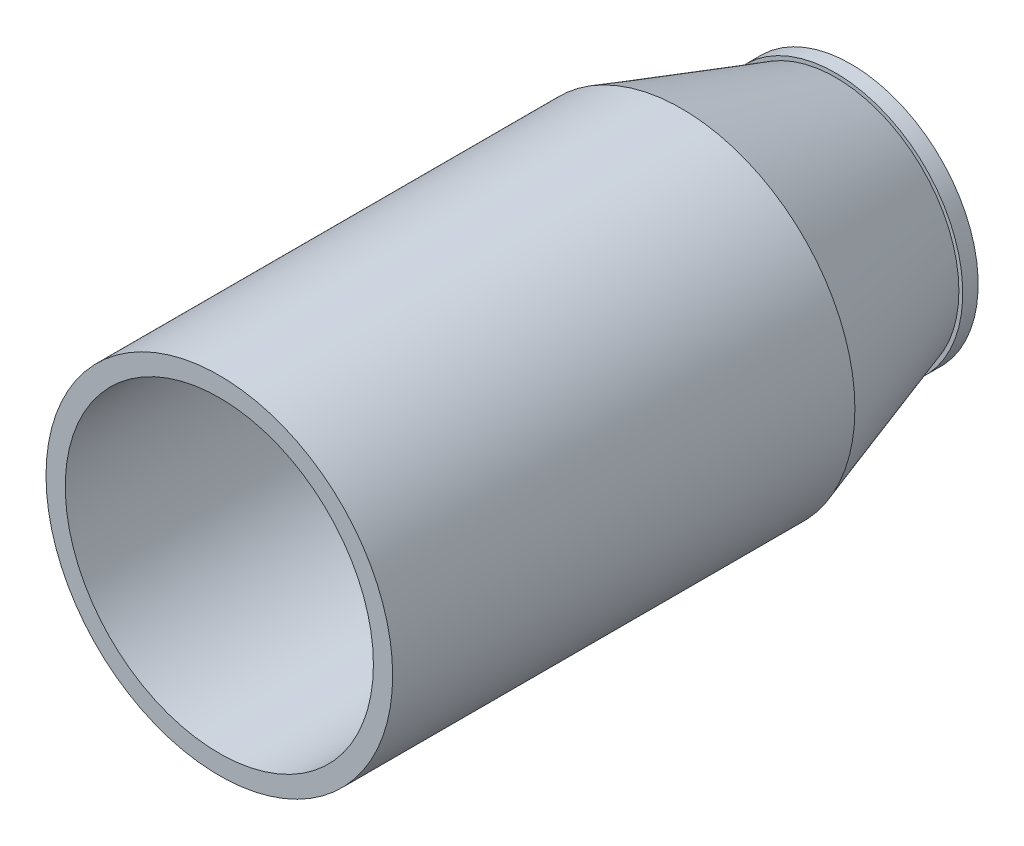
ISO-10303-21;
HEADER;
FILE_DESCRIPTION(('STEP AP214'),'2;1');
FILE_NAME('part.step','',(''),(''),'','','');
FILE_SCHEMA(('AUTOMOTIVE_DESIGN { 1 0 10303 214 1 1 1 1 }'));
ENDSEC;
DATA;
#1=APPLICATION_CONTEXT('core data for automotive mechanical design processes');
#2=APPLICATION_PROTOCOL_DEFINITION('international standard','automotive_design',2000,#1);
#3=PRODUCT_CONTEXT('',#1,'mechanical');
#4=PRODUCT('Part','Part','',(#3));
#5=PRODUCT_RELATED_PRODUCT_CATEGORY('part','',(#4));
#6=PRODUCT_DEFINITION_FORMATION('','',#4);
#7=PRODUCT_DEFINITION_CONTEXT('part definition',#1,'design');
#8=PRODUCT_DEFINITION('design','',#6,#7);
#9=PRODUCT_DEFINITION_SHAPE('','',#8);
#10=(LENGTH_UNIT() NAMED_UNIT(*) SI_UNIT(.MILLI.,.METRE.));
#11=(NAMED_UNIT(*) PLANE_ANGLE_UNIT() SI_UNIT($,.RADIAN.));
#12=(NAMED_UNIT(*) SI_UNIT($,.STERADIAN.) SOLID_ANGLE_UNIT());
#13=UNCERTAINTY_MEASURE_WITH_UNIT(LENGTH_MEASURE(1.E-05),#10,'distance_accuracy_value','');
#14=(GEOMETRIC_REPRESENTATION_CONTEXT(3) GLOBAL_UNCERTAINTY_ASSIGNED_CONTEXT((#13)) GLOBAL_UNIT_ASSIGNED_CONTEXT((#10,
#11,#12)) REPRESENTATION_CONTEXT('',''));
#15=CARTESIAN_POINT('',(0.,0.,0.));
#16=DIRECTION('',(0.,0.,1.));
#17=DIRECTION('',(1.,0.,0.));
#18=AXIS2_PLACEMENT_3D('',#15,#16,#17);
#19=CARTESIAN_POINT('',(0.,0.,-2100.));
#20=DIRECTION('',(0.,0.,-1.));
#21=DIRECTION('',(-1.,0.,0.));
#22=AXIS2_PLACEMENT_3D('',#19,#20,#21);
#23=PLANE('',#22);
#24=CARTESIAN_POINT('',(0.,0.,-2100.));
#25=DIRECTION('',(0.,0.,-1.));
#26=DIRECTION('',(-1.,0.,0.));
#27=AXIS2_PLACEMENT_3D('',#24,#25,#26);
#28=CIRCLE('',#27,825.);
#29=CARTESIAN_POINT('',(-825.,0.,-2100.));
#30=VERTEX_POINT('',#29);
#31=EDGE_CURVE('E11',#30,#30,#28,.T.);
#32=ORIENTED_EDGE('',*,*,#31,.T.);
#33=EDGE_LOOP('',(#32));
#34=FACE_BOUND('',#33,.T.);
#35=CARTESIAN_POINT('',(0.,0.,-2100.));
#36=DIRECTION('',(0.,0.,-1.));
#37=DIRECTION('',(-1.,0.,0.));
#38=AXIS2_PLACEMENT_3D('',#35,#36,#37);
#39=CIRCLE('',#38,800.);
#40=CARTESIAN_POINT('',(-800.,0.,-2100.));
#41=VERTEX_POINT('',#40);
#42=EDGE_CURVE('E60',#41,#41,#39,.T.);
#43=ORIENTED_EDGE('',*,*,#42,.F.);
#44=EDGE_LOOP('',(#43));
#45=FACE_BOUND('',#44,.T.);
#46=ADVANCED_FACE('F49',(#34,#45),#23,.T.);
#47=CARTESIAN_POINT('',(0.,0.,-2000.));
#48=DIRECTION('',(0.,0.,-1.));
#49=DIRECTION('',(-1.,0.,0.));
#50=AXIS2_PLACEMENT_3D('',#47,#48,#49);
#51=PLANE('',#50);
#52=CARTESIAN_POINT('',(0.,0.,-2000.));
#53=DIRECTION('',(0.,0.,-1.));
#54=DIRECTION('',(-1.,0.,0.));
#55=AXIS2_PLACEMENT_3D('',#52,#53,#54);
#56=CIRCLE('',#55,825.);
#57=CARTESIAN_POINT('',(-825.,0.,-2000.));
#58=VERTEX_POINT('',#57);
#59=EDGE_CURVE('E53',#58,#58,#56,.T.);
#60=ORIENTED_EDGE('',*,*,#59,.F.);
#61=EDGE_LOOP('',(#60));
#62=FACE_BOUND('',#61,.T.);
#63=CARTESIAN_POINT('',(0.,0.,-2000.));
#64=DIRECTION('',(0.,0.,-1.));
#65=DIRECTION('',(-1.,0.,0.));
#66=AXIS2_PLACEMENT_3D('',#63,#64,#65);
#67=CIRCLE('',#66,800.);
#68=CARTESIAN_POINT('',(-800.,0.,-2000.));
#69=VERTEX_POINT('',#68);
#70=EDGE_CURVE('E62',#69,#69,#67,.T.);
#71=ORIENTED_EDGE('',*,*,#70,.T.);
#72=EDGE_LOOP('',(#71));
#73=FACE_BOUND('',#72,.T.);
#74=ADVANCED_FACE('F72',(#62,#73),#51,.F.);
#75=CARTESIAN_POINT('',(0.,0.,-2100.));
#76=DIRECTION('',(0.,0.,1.));
#77=DIRECTION('',(1.,0.,0.));
#78=AXIS2_PLACEMENT_3D('',#75,#76,#77);
#79=CYLINDRICAL_SURFACE('',#78,825.);
#80=ORIENTED_EDGE('',*,*,#31,.F.);
#81=EDGE_LOOP('',(#80));
#82=FACE_BOUND('',#81,.T.);
#83=ORIENTED_EDGE('',*,*,#59,.T.);
#84=EDGE_LOOP('',(#83));
#85=FACE_BOUND('',#84,.T.);
#86=ADVANCED_FACE('F51',(#82,#85),#79,.T.);
#87=CARTESIAN_POINT('',(0.,0.,-2100.));
#88=DIRECTION('',(0.,0.,1.));
#89=DIRECTION('',(1.,0.,0.));
#90=AXIS2_PLACEMENT_3D('',#87,#88,#89);
#91=CYLINDRICAL_SURFACE('',#90,800.);
#92=ORIENTED_EDGE('',*,*,#42,.T.);
#93=EDGE_LOOP('',(#92));
#94=FACE_BOUND('',#93,.T.);
#95=ORIENTED_EDGE('',*,*,#70,.F.);
#96=EDGE_LOOP('',(#95));
#97=FACE_BOUND('',#96,.T.);
#98=ADVANCED_FACE('F68',(#94,#97),#91,.F.);
#99=CLOSED_SHELL('',(#46,#74,#86,#98));
#100=MANIFOLD_SOLID_BREP('B2',#99);
#101=CARTESIAN_POINT('',(0.,0.,2000.));
#102=DIRECTION('',(0.,0.,1.));
#103=DIRECTION('',(1.,0.,0.));
#104=AXIS2_PLACEMENT_3D('',#101,#102,#103);
#105=PLANE('',#104);
#106=CARTESIAN_POINT('',(0.,0.,2000.));
#107=DIRECTION('',(0.,0.,1.));
#108=DIRECTION('',(1.,0.,0.));
#109=AXIS2_PLACEMENT_3D('',#106,#107,#108);
#110=CIRCLE('',#109,1125.);
#111=CARTESIAN_POINT('',(1125.,0.,2000.));
#112=VERTEX_POINT('',#111);
#113=EDGE_CURVE('E48',#112,#112,#110,.T.);
#114=ORIENTED_EDGE('',*,*,#113,.T.);
#115=EDGE_LOOP('',(#114));
#116=FACE_BOUND('',#115,.T.);
#117=CARTESIAN_POINT('',(0.,0.,2000.));
#118=DIRECTION('',(0.,0.,1.));
#119=DIRECTION('',(1.,0.,0.));
#120=AXIS2_PLACEMENT_3D('',#117,#118,#119);
#121=CIRCLE('',#120,1000.);
#122=CARTESIAN_POINT('',(1000.,0.,2000.));
#123=VERTEX_POINT('',#122);
#124=EDGE_CURVE('E119',#123,#123,#121,.T.);
#125=ORIENTED_EDGE('',*,*,#124,.F.);
#126=EDGE_LOOP('',(#125));
#127=FACE_BOUND('',#126,.T.);
#128=ADVANCED_FACE('F111',(#116,#127),#105,.T.);
#129=CARTESIAN_POINT('',(0.,0.,2000.));
#130=DIRECTION('',(0.,0.,-1.));
#131=DIRECTION('',(-1.,0.,0.));
#132=AXIS2_PLACEMENT_3D('',#129,#130,#131);
#133=CYLINDRICAL_SURFACE('',#132,1125.);
#134=ORIENTED_EDGE('',*,*,#113,.F.);
#135=EDGE_LOOP('',(#134));
#136=FACE_BOUND('',#135,.T.);
#137=CARTESIAN_POINT('',(0.,0.,-1000.));
#138=DIRECTION('',(0.,0.,1.));
#139=DIRECTION('',(1.,0.,0.));
#140=AXIS2_PLACEMENT_3D('',#137,#138,#139);
#141=CIRCLE('',#140,1125.);
#142=CARTESIAN_POINT('',(1125.,0.,-1000.));
#143=VERTEX_POINT('',#142);
#144=EDGE_CURVE('E123',#143,#143,#141,.T.);
#145=ORIENTED_EDGE('',*,*,#144,.T.);
#146=EDGE_LOOP('',(#145));
#147=FACE_BOUND('',#146,.T.);
#148=ADVANCED_FACE('F113',(#136,#147),#133,.T.);
#149=CARTESIAN_POINT('',(0.,0.,2000.));
#150=DIRECTION('',(0.,0.,-1.));
#151=DIRECTION('',(-1.,0.,0.));
#152=AXIS2_PLACEMENT_3D('',#149,#150,#151);
#153=CYLINDRICAL_SURFACE('',#152,1000.);
#154=ORIENTED_EDGE('',*,*,#124,.T.);
#155=EDGE_LOOP('',(#154));
#156=FACE_BOUND('',#155,.T.);
#157=CARTESIAN_POINT('',(0.,0.,-1200.));
#158=DIRECTION('',(0.,0.,1.));
#159=DIRECTION('',(1.,0.,0.));
#160=AXIS2_PLACEMENT_3D('',#157,#158,#159);
#161=CIRCLE('',#160,1000.);
#162=CARTESIAN_POINT('',(1000.,0.,-1200.));
#163=VERTEX_POINT('',#162);
#164=EDGE_CURVE('E131',#163,#163,#161,.T.);
#165=ORIENTED_EDGE('',*,*,#164,.F.);
#166=EDGE_LOOP('',(#165));
#167=FACE_BOUND('',#166,.T.);
#168=ADVANCED_FACE('F150',(#156,#167),#153,.F.);
#169=CARTESIAN_POINT('',(0.,0.,-1000.));
#170=DIRECTION('',(0.,0.,1.));
#171=DIRECTION('',(1.,0.,0.));
#172=AXIS2_PLACEMENT_3D('',#169,#170,#171);
#173=CONICAL_SURFACE('',#172,1125.,0.314231899084338);
#174=CARTESIAN_POINT('',(0.,0.,-2000.));
#175=DIRECTION('',(0.,0.,1.));
#176=DIRECTION('',(1.,0.,0.));
#177=AXIS2_PLACEMENT_3D('',#174,#175,#176);
#178=CIRCLE('',#177,800.);
#179=CARTESIAN_POINT('',(800.,0.,-2000.));
#180=VERTEX_POINT('',#179);
#181=EDGE_CURVE('E128',#180,#180,#178,.T.);
#182=ORIENTED_EDGE('',*,*,#181,.T.);
#183=EDGE_LOOP('',(#182));
#184=FACE_BOUND('',#183,.T.);
#185=ORIENTED_EDGE('',*,*,#144,.F.);
#186=EDGE_LOOP('',(#185));
#187=FACE_BOUND('',#186,.T.);
#188=ADVANCED_FACE('F152',(#184,#187),#173,.T.);
#189=CARTESIAN_POINT('',(0.,0.,-2000.));
#190=DIRECTION('',(0.,0.,-1.));
#191=DIRECTION('',(-1.,0.,0.));
#192=AXIS2_PLACEMENT_3D('',#189,#190,#191);
#193=PLANE('',#192);
#194=CARTESIAN_POINT('',(0.,0.,-2000.));
#195=DIRECTION('',(0.,0.,-1.));
#196=DIRECTION('',(-1.,0.,0.));
#197=AXIS2_PLACEMENT_3D('',#194,#195,#196);
#198=CIRCLE('',#197,750.);
#199=CARTESIAN_POINT('',(-750.,0.,-2000.));
#200=VERTEX_POINT('',#199);
#201=EDGE_CURVE('E134',#200,#200,#198,.T.);
#202=ORIENTED_EDGE('',*,*,#201,.F.);
#203=EDGE_LOOP('',(#202));
#204=FACE_BOUND('',#203,.T.);
#205=ORIENTED_EDGE('',*,*,#181,.F.);
#206=EDGE_LOOP('',(#205));
#207=FACE_BOUND('',#206,.T.);
#208=ADVANCED_FACE('F146',(#204,#207),#193,.T.);
#209=CARTESIAN_POINT('',(0.,0.,-1200.));
#210=DIRECTION('',(0.,0.,1.));
#211=DIRECTION('',(1.,0.,0.));
#212=AXIS2_PLACEMENT_3D('',#209,#210,#211);
#213=PLANE('',#212);
#214=CARTESIAN_POINT('',(0.,0.,-1200.));
#215=DIRECTION('',(0.,0.,1.));
#216=DIRECTION('',(1.,0.,0.));
#217=AXIS2_PLACEMENT_3D('',#214,#215,#216);
#218=CIRCLE('',#217,750.);
#219=CARTESIAN_POINT('',(750.,0.,-1200.));
#220=VERTEX_POINT('',#219);
#221=EDGE_CURVE('E115',#220,#220,#218,.T.);
#222=ORIENTED_EDGE('',*,*,#221,.F.);
#223=EDGE_LOOP('',(#222));
#224=FACE_BOUND('',#223,.T.);
#225=ORIENTED_EDGE('',*,*,#164,.T.);
#226=EDGE_LOOP('',(#225));
#227=FACE_BOUND('',#226,.T.);
#228=ADVANCED_FACE('F143',(#224,#227),#213,.T.);
#229=CARTESIAN_POINT('',(0.,0.,-1000.));
#230=DIRECTION('',(0.,0.,-1.));
#231=DIRECTION('',(-1.,0.,0.));
#232=AXIS2_PLACEMENT_3D('',#229,#230,#231);
#233=CYLINDRICAL_SURFACE('',#232,750.);
#234=ORIENTED_EDGE('',*,*,#221,.T.);
#235=EDGE_LOOP('',(#234));
#236=FACE_BOUND('',#235,.T.);
#237=ORIENTED_EDGE('',*,*,#201,.T.);
#238=EDGE_LOOP('',(#237));
#239=FACE_BOUND('',#238,.T.);
#240=ADVANCED_FACE('F141',(#236,#239),#233,.F.);
#241=CLOSED_SHELL('',(#128,#148,#168,#188,#208,#228,#240));
#242=MANIFOLD_SOLID_BREP('B6',#241);
#243=ADVANCED_BREP_SHAPE_REPRESENTATION('',(#18,#100,#242),#14);
#244=SHAPE_DEFINITION_REPRESENTATION(#9,#243);
ENDSEC;
END-ISO-10303-21;
